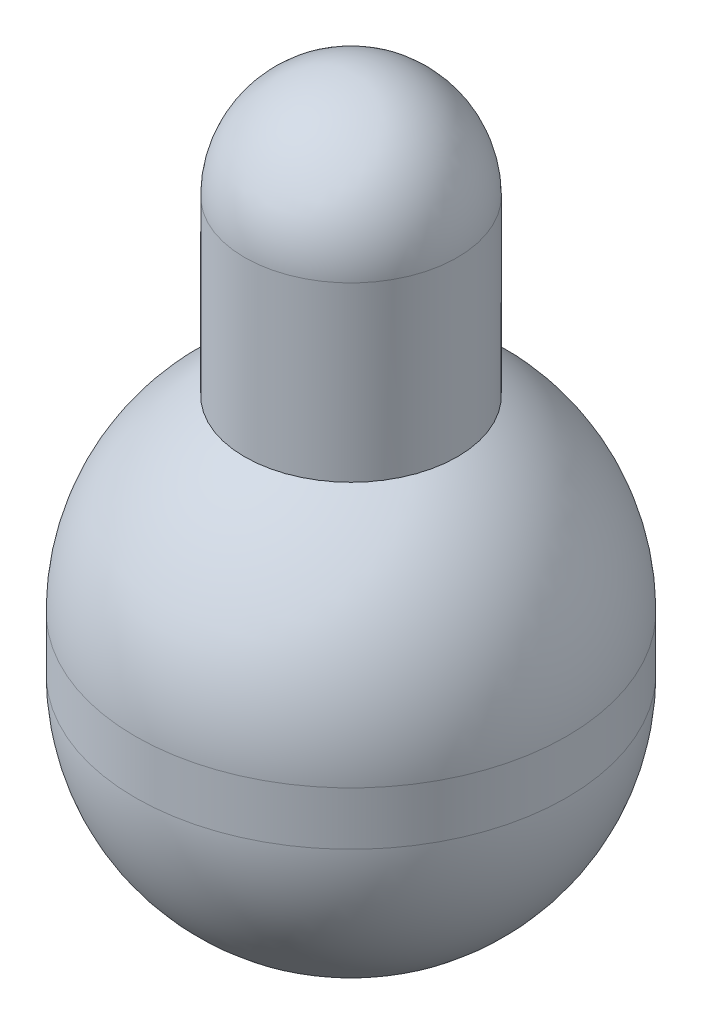
ISO-10303-21;
HEADER;
FILE_DESCRIPTION(('STEP AP214'),'2;1');
FILE_NAME('part.step','',(''),(''),'','','');
FILE_SCHEMA(('AUTOMOTIVE_DESIGN { 1 0 10303 214 1 1 1 1 }'));
ENDSEC;
DATA;
#1=APPLICATION_CONTEXT('core data for automotive mechanical design processes');
#2=APPLICATION_PROTOCOL_DEFINITION('international standard','automotive_design',2000,#1);
#3=PRODUCT_CONTEXT('',#1,'mechanical');
#4=PRODUCT('Part','Part','',(#3));
#5=PRODUCT_RELATED_PRODUCT_CATEGORY('part','',(#4));
#6=PRODUCT_DEFINITION_FORMATION('','',#4);
#7=PRODUCT_DEFINITION_CONTEXT('part definition',#1,'design');
#8=PRODUCT_DEFINITION('design','',#6,#7);
#9=PRODUCT_DEFINITION_SHAPE('','',#8);
#10=(LENGTH_UNIT() NAMED_UNIT(*) SI_UNIT(.MILLI.,.METRE.));
#11=(NAMED_UNIT(*) PLANE_ANGLE_UNIT() SI_UNIT($,.RADIAN.));
#12=(NAMED_UNIT(*) SI_UNIT($,.STERADIAN.) SOLID_ANGLE_UNIT());
#13=UNCERTAINTY_MEASURE_WITH_UNIT(LENGTH_MEASURE(1.E-05),#10,'distance_accuracy_value','');
#14=(GEOMETRIC_REPRESENTATION_CONTEXT(3) GLOBAL_UNCERTAINTY_ASSIGNED_CONTEXT((#13)) GLOBAL_UNIT_ASSIGNED_CONTEXT((#10,
#11,#12)) REPRESENTATION_CONTEXT('',''));
#15=CARTESIAN_POINT('',(0.,0.,0.));
#16=DIRECTION('',(0.,0.,1.));
#17=DIRECTION('',(1.,0.,0.));
#18=AXIS2_PLACEMENT_3D('',#15,#16,#17);
#19=CARTESIAN_POINT('',(3.44272829172517,47.9585980577962,62.3442432223416));
#20=DIRECTION('',(0.,-1.,0.));
#21=DIRECTION('',(1.,0.,0.));
#22=AXIS2_PLACEMENT_3D('',#19,#20,#21);
#23=CYLINDRICAL_SURFACE('',#22,30.8979721450186);
#24=CARTESIAN_POINT('',(3.44272829172517,47.9585980577962,62.3442432223416));
#25=DIRECTION('',(0.,1.,0.));
#26=DIRECTION('',(-1.,0.,0.));
#27=AXIS2_PLACEMENT_3D('',#24,#25,#26);
#28=CIRCLE('',#27,30.8979721450186);
#29=CARTESIAN_POINT('',(34.3407004367437,47.958598057796,62.3442432223416));
#30=VERTEX_POINT('',#29);
#31=EDGE_CURVE('P0_E10',#30,#30,#28,.T.);
#32=CARTESIAN_POINT('',(3.44272829172511,40.3385980577962,62.3442432223416));
#33=DIRECTION('',(0.,1.,0.));
#34=DIRECTION('',(-1.,0.,0.));
#35=AXIS2_PLACEMENT_3D('',#32,#33,#34);
#36=CIRCLE('',#35,30.8979721450186);
#37=CARTESIAN_POINT('',(34.3407004367437,40.338598057796,62.3442432223416));
#38=VERTEX_POINT('',#37);
#39=EDGE_CURVE('P0_E19',#38,#38,#36,.T.);
#40=CARTESIAN_POINT('',(34.3407004367437,47.958598057796,62.3442432223416));
#41=CARTESIAN_POINT('',(34.3407004367437,47.879223057796,62.3442432223416));
#42=CARTESIAN_POINT('',(34.3407004367437,47.799848057796,62.3442432223416));
#43=CARTESIAN_POINT('',(34.3407004367437,47.641098057796,62.3442432223416));
#44=CARTESIAN_POINT('',(34.3407004367437,47.561723057796,62.3442432223416));
#45=CARTESIAN_POINT('',(34.3407004367437,47.402973057796,62.3442432223416));
#46=CARTESIAN_POINT('',(34.3407004367437,47.323598057796,62.3442432223416));
#47=CARTESIAN_POINT('',(34.3407004367437,47.164848057796,62.3442432223416));
#48=CARTESIAN_POINT('',(34.3407004367437,47.085473057796,62.3442432223416));
#49=CARTESIAN_POINT('',(34.3407004367437,46.926723057796,62.3442432223416));
#50=CARTESIAN_POINT('',(34.3407004367437,46.847348057796,62.3442432223416));
#51=CARTESIAN_POINT('',(34.3407004367437,46.688598057796,62.3442432223416));
#52=CARTESIAN_POINT('',(34.3407004367437,46.609223057796,62.3442432223416));
#53=CARTESIAN_POINT('',(34.3407004367437,46.450473057796,62.3442432223416));
#54=CARTESIAN_POINT('',(34.3407004367437,46.371098057796,62.3442432223416));
#55=CARTESIAN_POINT('',(34.3407004367437,46.212348057796,62.3442432223416));
#56=CARTESIAN_POINT('',(34.3407004367437,46.132973057796,62.3442432223416));
#57=CARTESIAN_POINT('',(34.3407004367437,45.974223057796,62.3442432223416));
#58=CARTESIAN_POINT('',(34.3407004367437,45.894848057796,62.3442432223416));
#59=CARTESIAN_POINT('',(34.3407004367437,45.736098057796,62.3442432223416));
#60=CARTESIAN_POINT('',(34.3407004367437,45.656723057796,62.3442432223416));
#61=CARTESIAN_POINT('',(34.3407004367437,45.497973057796,62.3442432223416));
#62=CARTESIAN_POINT('',(34.3407004367437,45.418598057796,62.3442432223416));
#63=CARTESIAN_POINT('',(34.3407004367437,45.259848057796,62.3442432223416));
#64=CARTESIAN_POINT('',(34.3407004367437,45.180473057796,62.3442432223416));
#65=CARTESIAN_POINT('',(34.3407004367437,45.021723057796,62.3442432223416));
#66=CARTESIAN_POINT('',(34.3407004367437,44.942348057796,62.3442432223416));
#67=CARTESIAN_POINT('',(34.3407004367437,44.783598057796,62.3442432223416));
#68=CARTESIAN_POINT('',(34.3407004367437,44.704223057796,62.3442432223416));
#69=CARTESIAN_POINT('',(34.3407004367437,44.545473057796,62.3442432223416));
#70=CARTESIAN_POINT('',(34.3407004367437,44.466098057796,62.3442432223416));
#71=CARTESIAN_POINT('',(34.3407004367437,44.307348057796,62.3442432223416));
#72=CARTESIAN_POINT('',(34.3407004367437,44.227973057796,62.3442432223416));
#73=CARTESIAN_POINT('',(34.3407004367437,44.069223057796,62.3442432223416));
#74=CARTESIAN_POINT('',(34.3407004367437,43.989848057796,62.3442432223416));
#75=CARTESIAN_POINT('',(34.3407004367437,43.831098057796,62.3442432223416));
#76=CARTESIAN_POINT('',(34.3407004367437,43.751723057796,62.3442432223416));
#77=CARTESIAN_POINT('',(34.3407004367437,43.592973057796,62.3442432223416));
#78=CARTESIAN_POINT('',(34.3407004367437,43.513598057796,62.3442432223416));
#79=CARTESIAN_POINT('',(34.3407004367437,43.354848057796,62.3442432223416));
#80=CARTESIAN_POINT('',(34.3407004367437,43.275473057796,62.3442432223416));
#81=CARTESIAN_POINT('',(34.3407004367437,43.116723057796,62.3442432223416));
#82=CARTESIAN_POINT('',(34.3407004367437,43.037348057796,62.3442432223416));
#83=CARTESIAN_POINT('',(34.3407004367437,42.878598057796,62.3442432223416));
#84=CARTESIAN_POINT('',(34.3407004367437,42.799223057796,62.3442432223416));
#85=CARTESIAN_POINT('',(34.3407004367437,42.640473057796,62.3442432223416));
#86=CARTESIAN_POINT('',(34.3407004367437,42.561098057796,62.3442432223416));
#87=CARTESIAN_POINT('',(34.3407004367437,42.402348057796,62.3442432223416));
#88=CARTESIAN_POINT('',(34.3407004367437,42.322973057796,62.3442432223416));
#89=CARTESIAN_POINT('',(34.3407004367437,42.164223057796,62.3442432223416));
#90=CARTESIAN_POINT('',(34.3407004367437,42.084848057796,62.3442432223416));
#91=CARTESIAN_POINT('',(34.3407004367437,41.926098057796,62.3442432223416));
#92=CARTESIAN_POINT('',(34.3407004367437,41.846723057796,62.3442432223416));
#93=CARTESIAN_POINT('',(34.3407004367437,41.687973057796,62.3442432223416));
#94=CARTESIAN_POINT('',(34.3407004367437,41.608598057796,62.3442432223416));
#95=CARTESIAN_POINT('',(34.3407004367437,41.449848057796,62.3442432223416));
#96=CARTESIAN_POINT('',(34.3407004367437,41.370473057796,62.3442432223416));
#97=CARTESIAN_POINT('',(34.3407004367437,41.211723057796,62.3442432223416));
#98=CARTESIAN_POINT('',(34.3407004367437,41.132348057796,62.3442432223416));
#99=CARTESIAN_POINT('',(34.3407004367437,40.973598057796,62.3442432223416));
#100=CARTESIAN_POINT('',(34.3407004367437,40.894223057796,62.3442432223416));
#101=CARTESIAN_POINT('',(34.3407004367437,40.735473057796,62.3442432223416));
#102=CARTESIAN_POINT('',(34.3407004367437,40.656098057796,62.3442432223416));
#103=CARTESIAN_POINT('',(34.3407004367437,40.497348057796,62.3442432223416));
#104=CARTESIAN_POINT('',(34.3407004367437,40.417973057796,62.3442432223416));
#105=CARTESIAN_POINT('',(34.3407004367437,40.338598057796,62.3442432223416));
#106=B_SPLINE_CURVE_WITH_KNOTS('',3,(#40,#41,#42,#43,#44,#45,#46,#47,#48,#49,#50,#51,#52,#53,
#54,#55,#56,#57,#58,#59,#60,#61,#62,#63,#64,#65,#66,#67,#68,#69,#70,#71,#72,#73,#74,#75,#76,#77,
#78,#79,#80,#81,#82,#83,#84,#85,#86,#87,#88,#89,#90,#91,#92,#93,#94,#95,#96,#97,#98,#99,#100,
#101,#102,#103,#104,#105),.UNSPECIFIED.,.F.,.F.,(4,2,2,2,2,2,2,2,2,2,2,2,2,2,2,2,2,2,2,2,2,2,2,
2,2,2,2,2,2,2,2,2,4),(0.,0.238124999999999,0.476249999999998,0.714374999999996,
0.952499999999995,1.19062499999999,1.42875,1.666875,1.905,2.143125,2.38124999999999,
2.61937499999999,2.8575,3.095625,3.33375,3.571875,3.80999999999999,4.048125,4.28625,4.524375,
4.7625,5.00062499999999,5.23875,5.476875,5.715,5.953125,6.19125,6.42937499999999,6.6675,
6.905625,7.14375,7.381875,7.61999999999999),.UNSPECIFIED.);
#107=EDGE_CURVE('P0_BSEAM15',#30,#38,#106,.T.);
#108=ORIENTED_EDGE('',*,*,#31,.F.);
#109=ORIENTED_EDGE('',*,*,#39,.T.);
#110=ORIENTED_EDGE('',*,*,#107,.T.);
#111=ORIENTED_EDGE('',*,*,#107,.F.);
#112=EDGE_LOOP('',(#108,#110,#109,#111));
#113=FACE_BOUND('',#112,.T.);
#114=ADVANCED_FACE('P0_F15',(#113),#23,.T.);
#115=CARTESIAN_POINT('',(3.44272829172511,40.3385980577962,62.3442432223416));
#116=DIRECTION('',(0.,0.,1.));
#117=DIRECTION('',(1.,0.,0.));
#118=AXIS2_PLACEMENT_3D('',#115,#116,#117);
#119=SPHERICAL_SURFACE('',#118,30.8979721450186);
#120=CARTESIAN_POINT('',(3.44272829172511,40.3385980577962,62.3442432223416));
#121=DIRECTION('',(0.,1.,0.));
#122=DIRECTION('',(-1.,0.,0.));
#123=AXIS2_PLACEMENT_3D('',#120,#121,#122);
#124=SPHERICAL_SURFACE('',#123,30.8979721450186);
#125=ORIENTED_EDGE('',*,*,#39,.F.);
#126=EDGE_LOOP('',(#125));
#127=FACE_BOUND('',#126,.T.);
#128=ADVANCED_FACE('P0_F17',(#127),#124,.T.);
#129=CARTESIAN_POINT('',(3.44272829172517,47.9585980577962,62.3442432223416));
#130=DIRECTION('',(0.,0.,-1.));
#131=DIRECTION('',(-1.,0.,0.));
#132=AXIS2_PLACEMENT_3D('',#129,#130,#131);
#133=SPHERICAL_SURFACE('',#132,30.8979721450186);
#134=CARTESIAN_POINT('',(3.44272829172517,47.9585980577962,62.3442432223416));
#135=DIRECTION('',(0.,1.,0.));
#136=DIRECTION('',(-1.,0.,0.));
#137=AXIS2_PLACEMENT_3D('',#134,#135,#136);
#138=SPHERICAL_SURFACE('',#137,30.8979721450186);
#139=ORIENTED_EDGE('',*,*,#31,.T.);
#140=EDGE_LOOP('',(#139));
#141=FACE_BOUND('',#140,.T.);
#142=ADVANCED_FACE('P0_F30',(#141),#138,.T.);
#143=CLOSED_SHELL('',(#114,#128,#142));
#144=MANIFOLD_SOLID_BREP('P0_B1',#143);
#145=CARTESIAN_POINT('',(3.44272829172414,99.5587574062778,62.3442432223416));
#146=DIRECTION('',(0.,0.,-1.));
#147=DIRECTION('',(-1.,0.,0.));
#148=AXIS2_PLACEMENT_3D('',#145,#146,#147);
#149=SPHERICAL_SURFACE('',#148,15.24);
#150=CARTESIAN_POINT('',(3.44272829172414,99.5587574062778,62.3442432223416));
#151=DIRECTION('',(0.,-1.,0.));
#152=DIRECTION('',(0.,0.,1.));
#153=AXIS2_PLACEMENT_3D('',#150,#151,#152);
#154=SPHERICAL_SURFACE('',#153,15.24);
#155=CARTESIAN_POINT('',(3.44272829172414,99.5587574062778,62.3442432223416));
#156=DIRECTION('',(0.,-1.,0.));
#157=DIRECTION('',(0.,0.,1.));
#158=AXIS2_PLACEMENT_3D('',#155,#156,#157);
#159=CIRCLE('',#158,15.24);
#160=CARTESIAN_POINT('',(3.44272829172414,99.5587574062778,77.5842432223416));
#161=VERTEX_POINT('',#160);
#162=EDGE_CURVE('P1_E9',#161,#161,#159,.T.);
#163=ORIENTED_EDGE('',*,*,#162,.F.);
#164=EDGE_LOOP('',(#163));
#165=FACE_BOUND('',#164,.T.);
#166=ADVANCED_FACE('P1_F14',(#165),#154,.T.);
#167=CARTESIAN_POINT('',(3.44272829172431,74.1587574062778,62.3442432223416));
#168=DIRECTION('',(0.,1.,0.));
#169=DIRECTION('',(-1.,0.,0.));
#170=AXIS2_PLACEMENT_3D('',#167,#168,#169);
#171=CYLINDRICAL_SURFACE('',#170,15.24);
#172=CARTESIAN_POINT('',(3.44272829172431,74.1587574062778,62.3442432223416));
#173=DIRECTION('',(0.,-1.,0.));
#174=DIRECTION('',(1.,0.,0.));
#175=AXIS2_PLACEMENT_3D('',#172,#173,#174);
#176=CIRCLE('',#175,15.24);
#177=CARTESIAN_POINT('',(18.6827282917243,74.1587574062779,62.3442432223416));
#178=VERTEX_POINT('',#177);
#179=EDGE_CURVE('P1_E20',#178,#178,#176,.T.);
#180=ORIENTED_EDGE('',*,*,#179,.F.);
#181=EDGE_LOOP('',(#180));
#182=FACE_BOUND('',#181,.T.);
#183=ORIENTED_EDGE('',*,*,#162,.T.);
#184=EDGE_LOOP('',(#183));
#185=FACE_BOUND('',#184,.T.);
#186=ADVANCED_FACE('P1_F28',(#182,#185),#171,.T.);
#187=CARTESIAN_POINT('',(3.44272829172431,74.1587574062778,62.3442432223416));
#188=DIRECTION('',(0.,-1.,0.));
#189=DIRECTION('',(1.,0.,0.));
#190=AXIS2_PLACEMENT_3D('',#187,#188,#189);
#191=PLANE('',#190);
#192=ORIENTED_EDGE('',*,*,#179,.T.);
#193=EDGE_LOOP('',(#192));
#194=FACE_BOUND('',#193,.T.);
#195=ADVANCED_FACE('P1_F26',(#194),#191,.T.);
#196=CLOSED_SHELL('',(#166,#186,#195));
#197=MANIFOLD_SOLID_BREP('P1_B1',#196);
#198=ADVANCED_BREP_SHAPE_REPRESENTATION('',(#18,#144,#197),#14);
#199=SHAPE_DEFINITION_REPRESENTATION(#9,#198);
ENDSEC;
END-ISO-10303-21;
